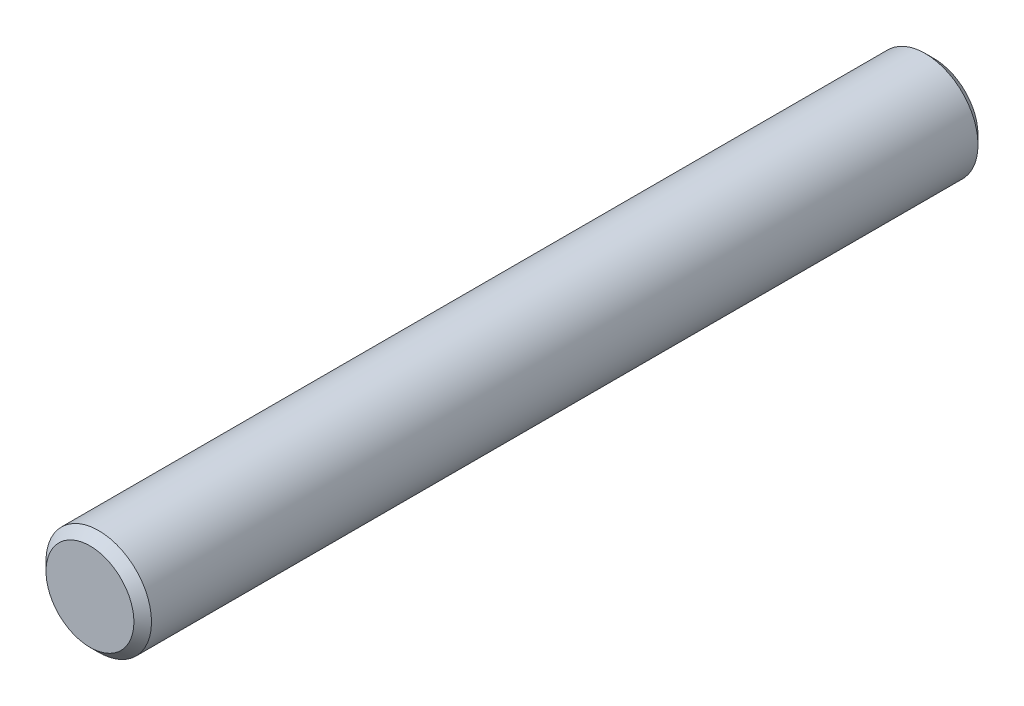
ISO-10303-21;
HEADER;
FILE_DESCRIPTION(('STEP AP214'),'2;1');
FILE_NAME('part.step','',(''),(''),'','','');
FILE_SCHEMA(('AUTOMOTIVE_DESIGN { 1 0 10303 214 1 1 1 1 }'));
ENDSEC;
DATA;
#1=APPLICATION_CONTEXT('core data for automotive mechanical design processes');
#2=APPLICATION_PROTOCOL_DEFINITION('international standard','automotive_design',2000,#1);
#3=PRODUCT_CONTEXT('',#1,'mechanical');
#4=PRODUCT('Part','Part','',(#3));
#5=PRODUCT_RELATED_PRODUCT_CATEGORY('part','',(#4));
#6=PRODUCT_DEFINITION_FORMATION('','',#4);
#7=PRODUCT_DEFINITION_CONTEXT('part definition',#1,'design');
#8=PRODUCT_DEFINITION('design','',#6,#7);
#9=PRODUCT_DEFINITION_SHAPE('','',#8);
#10=(LENGTH_UNIT() NAMED_UNIT(*) SI_UNIT(.MILLI.,.METRE.));
#11=(NAMED_UNIT(*) PLANE_ANGLE_UNIT() SI_UNIT($,.RADIAN.));
#12=(NAMED_UNIT(*) SI_UNIT($,.STERADIAN.) SOLID_ANGLE_UNIT());
#13=UNCERTAINTY_MEASURE_WITH_UNIT(LENGTH_MEASURE(1.E-05),#10,'distance_accuracy_value','');
#14=(GEOMETRIC_REPRESENTATION_CONTEXT(3) GLOBAL_UNCERTAINTY_ASSIGNED_CONTEXT((#13)) GLOBAL_UNIT_ASSIGNED_CONTEXT((#10,
#11,#12)) REPRESENTATION_CONTEXT('',''));
#15=CARTESIAN_POINT('',(0.,0.,0.));
#16=DIRECTION('',(0.,0.,1.));
#17=DIRECTION('',(1.,0.,0.));
#18=AXIS2_PLACEMENT_3D('',#15,#16,#17);
#19=CARTESIAN_POINT('',(0.,0.,24.));
#20=DIRECTION('',(0.,0.,-1.));
#21=DIRECTION('',(-1.,0.,0.));
#22=AXIS2_PLACEMENT_3D('',#19,#20,#21);
#23=CYLINDRICAL_SURFACE('',#22,1.5);
#24=CARTESIAN_POINT('',(0.,0.,23.75));
#25=DIRECTION('',(0.,0.,1.));
#26=DIRECTION('',(1.,0.,0.));
#27=AXIS2_PLACEMENT_3D('',#24,#25,#26);
#28=CIRCLE('',#27,1.5);
#29=CARTESIAN_POINT('',(1.5,0.,23.75));
#30=VERTEX_POINT('',#29);
#31=EDGE_CURVE('E38',#30,#30,#28,.F.);
#32=ORIENTED_EDGE('',*,*,#31,.T.);
#33=EDGE_LOOP('',(#32));
#34=FACE_BOUND('',#33,.T.);
#35=CARTESIAN_POINT('',(0.,0.,0.249999999999997));
#36=DIRECTION('',(0.,0.,1.));
#37=DIRECTION('',(1.,0.,0.));
#38=AXIS2_PLACEMENT_3D('',#35,#36,#37);
#39=CIRCLE('',#38,1.5);
#40=CARTESIAN_POINT('',(1.5,0.,0.249999999999997));
#41=VERTEX_POINT('',#40);
#42=EDGE_CURVE('E42',#41,#41,#39,.T.);
#43=ORIENTED_EDGE('',*,*,#42,.T.);
#44=EDGE_LOOP('',(#43));
#45=FACE_BOUND('',#44,.T.);
#46=ADVANCED_FACE('F31',(#34,#45),#23,.T.);
#47=CARTESIAN_POINT('',(0.,0.,24.));
#48=DIRECTION('',(0.,0.,1.));
#49=DIRECTION('',(1.,0.,0.));
#50=AXIS2_PLACEMENT_3D('',#47,#48,#49);
#51=PLANE('',#50);
#52=CARTESIAN_POINT('',(0.,0.,24.));
#53=DIRECTION('',(0.,0.,1.));
#54=DIRECTION('',(1.,0.,0.));
#55=AXIS2_PLACEMENT_3D('',#52,#53,#54);
#56=CIRCLE('',#55,1.25);
#57=CARTESIAN_POINT('',(1.25,0.,24.));
#58=VERTEX_POINT('',#57);
#59=EDGE_CURVE('E46',#58,#58,#56,.T.);
#60=ORIENTED_EDGE('',*,*,#59,.T.);
#61=EDGE_LOOP('',(#60));
#62=FACE_BOUND('',#61,.T.);
#63=ADVANCED_FACE('F52',(#62),#51,.T.);
#64=CARTESIAN_POINT('',(0.,0.,0.));
#65=DIRECTION('',(0.,0.,1.));
#66=DIRECTION('',(1.,0.,0.));
#67=AXIS2_PLACEMENT_3D('',#64,#65,#66);
#68=PLANE('',#67);
#69=CARTESIAN_POINT('',(0.,0.,0.));
#70=DIRECTION('',(0.,0.,1.));
#71=DIRECTION('',(1.,0.,0.));
#72=AXIS2_PLACEMENT_3D('',#69,#70,#71);
#73=CIRCLE('',#72,1.25);
#74=CARTESIAN_POINT('',(1.25,0.,0.));
#75=VERTEX_POINT('',#74);
#76=EDGE_CURVE('E10',#75,#75,#73,.F.);
#77=ORIENTED_EDGE('',*,*,#76,.T.);
#78=EDGE_LOOP('',(#77));
#79=FACE_BOUND('',#78,.T.);
#80=ADVANCED_FACE('F56',(#79),#68,.F.);
#81=CARTESIAN_POINT('',(0.,0.,24.));
#82=DIRECTION('',(0.,0.,-1.));
#83=DIRECTION('',(-1.,0.,0.));
#84=AXIS2_PLACEMENT_3D('',#81,#82,#83);
#85=CONICAL_SURFACE('',#84,1.25,0.785398163397453);
#86=ORIENTED_EDGE('',*,*,#31,.F.);
#87=EDGE_LOOP('',(#86));
#88=FACE_BOUND('',#87,.T.);
#89=ORIENTED_EDGE('',*,*,#59,.F.);
#90=EDGE_LOOP('',(#89));
#91=FACE_BOUND('',#90,.T.);
#92=ADVANCED_FACE('F54',(#88,#91),#85,.T.);
#93=CARTESIAN_POINT('',(0.,0.,0.249999999999997));
#94=DIRECTION('',(0.,0.,1.));
#95=DIRECTION('',(1.,0.,0.));
#96=AXIS2_PLACEMENT_3D('',#93,#94,#95);
#97=CONICAL_SURFACE('',#96,1.5,0.785398163397453);
#98=ORIENTED_EDGE('',*,*,#76,.F.);
#99=EDGE_LOOP('',(#98));
#100=FACE_BOUND('',#99,.T.);
#101=ORIENTED_EDGE('',*,*,#42,.F.);
#102=EDGE_LOOP('',(#101));
#103=FACE_BOUND('',#102,.T.);
#104=ADVANCED_FACE('F33',(#100,#103),#97,.T.);
#105=CLOSED_SHELL('',(#46,#63,#80,#92,#104));
#106=MANIFOLD_SOLID_BREP('B2',#105);
#107=ADVANCED_BREP_SHAPE_REPRESENTATION('',(#18,#106),#14);
#108=SHAPE_DEFINITION_REPRESENTATION(#9,#107);
ENDSEC;
END-ISO-10303-21;
